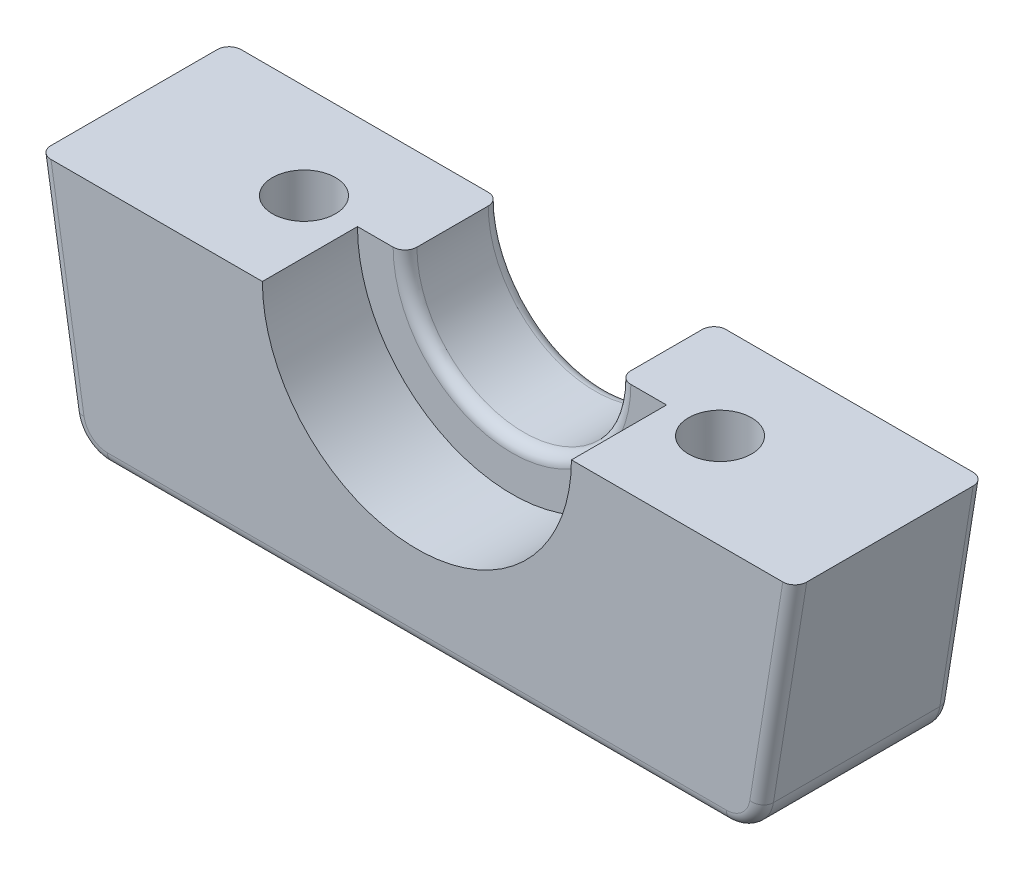
ISO-10303-21;
HEADER;
FILE_DESCRIPTION(('STEP AP214'),'2;1');
FILE_NAME('part.step','',(''),(''),'','','');
FILE_SCHEMA(('AUTOMOTIVE_DESIGN { 1 0 10303 214 1 1 1 1 }'));
ENDSEC;
DATA;
#1=APPLICATION_CONTEXT('core data for automotive mechanical design processes');
#2=APPLICATION_PROTOCOL_DEFINITION('international standard','automotive_design',2000,#1);
#3=PRODUCT_CONTEXT('',#1,'mechanical');
#4=PRODUCT('Part','Part','',(#3));
#5=PRODUCT_RELATED_PRODUCT_CATEGORY('part','',(#4));
#6=PRODUCT_DEFINITION_FORMATION('','',#4);
#7=PRODUCT_DEFINITION_CONTEXT('part definition',#1,'design');
#8=PRODUCT_DEFINITION('design','',#6,#7);
#9=PRODUCT_DEFINITION_SHAPE('','',#8);
#10=(LENGTH_UNIT() NAMED_UNIT(*) SI_UNIT(.MILLI.,.METRE.));
#11=(NAMED_UNIT(*) PLANE_ANGLE_UNIT() SI_UNIT($,.RADIAN.));
#12=(NAMED_UNIT(*) SI_UNIT($,.STERADIAN.) SOLID_ANGLE_UNIT());
#13=UNCERTAINTY_MEASURE_WITH_UNIT(LENGTH_MEASURE(1.E-05),#10,'distance_accuracy_value','');
#14=(GEOMETRIC_REPRESENTATION_CONTEXT(3) GLOBAL_UNCERTAINTY_ASSIGNED_CONTEXT((#13)) GLOBAL_UNIT_ASSIGNED_CONTEXT((#10,
#11,#12)) REPRESENTATION_CONTEXT('',''));
#15=CARTESIAN_POINT('',(0.,0.,0.));
#16=DIRECTION('',(0.,0.,1.));
#17=DIRECTION('',(1.,0.,0.));
#18=AXIS2_PLACEMENT_3D('',#15,#16,#17);
#19=CARTESIAN_POINT('',(0.,0.,8.));
#20=DIRECTION('',(0.,1.,0.));
#21=DIRECTION('',(0.,0.,1.));
#22=AXIS2_PLACEMENT_3D('',#19,#20,#21);
#23=PLANE('',#22);
#24=CARTESIAN_POINT('',(17.5,0.,0.));
#25=DIRECTION('',(0.,-1.,0.));
#26=DIRECTION('',(0.,0.,-1.));
#27=AXIS2_PLACEMENT_3D('',#24,#25,#26);
#28=CIRCLE('',#27,5.);
#29=CARTESIAN_POINT('',(17.5,0.,-5.));
#30=VERTEX_POINT('',#29);
#31=EDGE_CURVE('E382',#30,#30,#28,.T.);
#32=ORIENTED_EDGE('',*,*,#31,.F.);
#33=EDGE_LOOP('',(#32));
#34=FACE_BOUND('',#33,.T.);
#35=DIRECTION('',(0.,0.,-1.));
#36=VECTOR('',#35,1.);
#37=CARTESIAN_POINT('',(26.0322338581306,0.,8.));
#38=LINE('',#37,#36);
#39=CARTESIAN_POINT('',(26.0322338581306,0.,-7.));
#40=VERTEX_POINT('',#39);
#41=CARTESIAN_POINT('',(26.0322338581306,0.,7.));
#42=VERTEX_POINT('',#41);
#43=EDGE_CURVE('E260',#40,#42,#38,.F.);
#44=ORIENTED_EDGE('',*,*,#43,.T.);
#45=DIRECTION('',(1.,0.,0.));
#46=VECTOR('',#45,1.);
#47=CARTESIAN_POINT('',(-26.0322338581306,0.,7.));
#48=LINE('',#47,#46);
#49=CARTESIAN_POINT('',(-26.0322338581306,0.,7.));
#50=VERTEX_POINT('',#49);
#51=EDGE_CURVE('E318',#42,#50,#48,.F.);
#52=ORIENTED_EDGE('',*,*,#51,.T.);
#53=DIRECTION('',(0.,0.,-1.));
#54=VECTOR('',#53,1.);
#55=CARTESIAN_POINT('',(-26.0322338581306,0.,-8.));
#56=LINE('',#55,#54);
#57=CARTESIAN_POINT('',(-26.0322338581306,0.,-7.));
#58=VERTEX_POINT('',#57);
#59=EDGE_CURVE('E264',#50,#58,#56,.T.);
#60=ORIENTED_EDGE('',*,*,#59,.T.);
#61=DIRECTION('',(1.,0.,0.));
#62=VECTOR('',#61,1.);
#63=CARTESIAN_POINT('',(0.,0.,-7.));
#64=LINE('',#63,#62);
#65=EDGE_CURVE('E315',#58,#40,#64,.T.);
#66=ORIENTED_EDGE('',*,*,#65,.T.);
#67=EDGE_LOOP('',(#44,#52,#60,#66));
#68=FACE_BOUND('',#67,.T.);
#69=CARTESIAN_POINT('',(-17.5,0.,0.));
#70=DIRECTION('',(0.,-1.,0.));
#71=DIRECTION('',(0.,0.,-1.));
#72=AXIS2_PLACEMENT_3D('',#69,#70,#71);
#73=CIRCLE('',#72,5.);
#74=CARTESIAN_POINT('',(-17.5,0.,-5.));
#75=VERTEX_POINT('',#74);
#76=EDGE_CURVE('E442',#75,#75,#73,.T.);
#77=ORIENTED_EDGE('',*,*,#76,.F.);
#78=EDGE_LOOP('',(#77));
#79=FACE_BOUND('',#78,.T.);
#80=ADVANCED_FACE('F41',(#34,#68,#79),#23,.F.);
#81=CARTESIAN_POINT('',(31.7948717948718,20.,8.));
#82=DIRECTION('',(0.,-1.,0.));
#83=DIRECTION('',(1.,0.,0.));
#84=AXIS2_PLACEMENT_3D('',#81,#82,#83);
#85=PLANE('',#84);
#86=CARTESIAN_POINT('',(17.5,20.,0.));
#87=DIRECTION('',(0.,-1.,0.));
#88=DIRECTION('',(1.,0.,0.));
#89=AXIS2_PLACEMENT_3D('',#86,#87,#88);
#90=CIRCLE('',#89,2.65);
#91=CARTESIAN_POINT('',(20.15,20.,0.));
#92=VERTEX_POINT('',#91);
#93=EDGE_CURVE('E445',#92,#92,#90,.T.);
#94=ORIENTED_EDGE('',*,*,#93,.T.);
#95=EDGE_LOOP('',(#94));
#96=FACE_BOUND('',#95,.T.);
#97=DIRECTION('',(-1.,0.,0.));
#98=VECTOR('',#97,1.);
#99=CARTESIAN_POINT('',(31.7948717948718,20.,-8.));
#100=LINE('',#99,#98);
#101=CARTESIAN_POINT('',(30.7821121407444,20.,-8.));
#102=VERTEX_POINT('',#101);
#103=CARTESIAN_POINT('',(10.,20.,-8.));
#104=VERTEX_POINT('',#103);
#105=EDGE_CURVE('E255',#102,#104,#100,.T.);
#106=ORIENTED_EDGE('',*,*,#105,.T.);
#107=CARTESIAN_POINT('',(10.,20.,-7.00000000000001));
#108=DIRECTION('',(0.,-1.,0.));
#109=DIRECTION('',(1.,0.,0.));
#110=AXIS2_PLACEMENT_3D('',#107,#108,#109);
#111=CIRCLE('',#110,1.);
#112=CARTESIAN_POINT('',(9.00000000000001,20.,-7.00000000000001));
#113=VERTEX_POINT('',#112);
#114=EDGE_CURVE('E360',#104,#113,#111,.F.);
#115=ORIENTED_EDGE('',*,*,#114,.T.);
#116=DIRECTION('',(0.,0.,-1.));
#117=VECTOR('',#116,1.);
#118=CARTESIAN_POINT('',(9.00000000000001,20.,95.6925416989547));
#119=LINE('',#118,#117);
#120=CARTESIAN_POINT('',(9.00000000000001,20.,-1.));
#121=VERTEX_POINT('',#120);
#122=EDGE_CURVE('E242',#121,#113,#119,.T.);
#123=ORIENTED_EDGE('',*,*,#122,.F.);
#124=CARTESIAN_POINT('',(10.,20.,-1.));
#125=DIRECTION('',(0.,-1.,0.));
#126=DIRECTION('',(1.,0.,0.));
#127=AXIS2_PLACEMENT_3D('',#124,#125,#126);
#128=CIRCLE('',#127,1.);
#129=CARTESIAN_POINT('',(10.,20.,0.));
#130=VERTEX_POINT('',#129);
#131=EDGE_CURVE('E232',#121,#130,#128,.F.);
#132=ORIENTED_EDGE('',*,*,#131,.T.);
#133=DIRECTION('',(-1.,0.,0.));
#134=VECTOR('',#133,1.);
#135=CARTESIAN_POINT('',(-13.,20.,0.));
#136=LINE('',#135,#134);
#137=CARTESIAN_POINT('',(13.,20.,0.));
#138=VERTEX_POINT('',#137);
#139=EDGE_CURVE('E218',#138,#130,#136,.T.);
#140=ORIENTED_EDGE('',*,*,#139,.F.);
#141=DIRECTION('',(0.,0.,1.));
#142=VECTOR('',#141,1.);
#143=CARTESIAN_POINT('',(13.,20.,0.));
#144=LINE('',#143,#142);
#145=CARTESIAN_POINT('',(13.,20.,8.));
#146=VERTEX_POINT('',#145);
#147=EDGE_CURVE('E208',#138,#146,#144,.T.);
#148=ORIENTED_EDGE('',*,*,#147,.T.);
#149=DIRECTION('',(-1.,0.,0.));
#150=VECTOR('',#149,1.);
#151=CARTESIAN_POINT('',(31.7948717948718,20.,8.));
#152=LINE('',#151,#150);
#153=CARTESIAN_POINT('',(30.7821121407444,20.,8.));
#154=VERTEX_POINT('',#153);
#155=EDGE_CURVE('E250',#154,#146,#152,.T.);
#156=ORIENTED_EDGE('',*,*,#155,.F.);
#157=CARTESIAN_POINT('',(30.7821121407444,20.,7.));
#158=DIRECTION('',(0.,-1.,0.));
#159=DIRECTION('',(-1.,0.,0.));
#160=AXIS2_PLACEMENT_3D('',#157,#158,#159);
#161=ELLIPSE('',#160,1.01275965412741,1.);
#162=CARTESIAN_POINT('',(31.7948717948718,20.,7.));
#163=VERTEX_POINT('',#162);
#164=EDGE_CURVE('E72',#154,#163,#161,.F.);
#165=ORIENTED_EDGE('',*,*,#164,.T.);
#166=DIRECTION('',(0.,0.,-1.));
#167=VECTOR('',#166,1.);
#168=CARTESIAN_POINT('',(31.7948717948718,20.,8.));
#169=LINE('',#168,#167);
#170=CARTESIAN_POINT('',(31.7948717948718,20.,-7.));
#171=VERTEX_POINT('',#170);
#172=EDGE_CURVE('E253',#163,#171,#169,.T.);
#173=ORIENTED_EDGE('',*,*,#172,.T.);
#174=CARTESIAN_POINT('',(30.7821121407444,20.,-7.));
#175=DIRECTION('',(0.,-1.,0.));
#176=DIRECTION('',(1.,0.,0.));
#177=AXIS2_PLACEMENT_3D('',#174,#175,#176);
#178=ELLIPSE('',#177,1.01275965412741,1.);
#179=EDGE_CURVE('E353',#171,#102,#178,.F.);
#180=ORIENTED_EDGE('',*,*,#179,.T.);
#181=EDGE_LOOP('',(#106,#115,#123,#132,#140,#148,#156,#165,#173,#180));
#182=FACE_BOUND('',#181,.T.);
#183=ADVANCED_FACE('F229',(#96,#182),#85,.F.);
#184=CARTESIAN_POINT('',(28.5897435897436,0.,8.));
#185=DIRECTION('',(-0.987401103435145,0.158237356319734,0.));
#186=DIRECTION('',(-0.158237356319734,-0.987401103435145,0.));
#187=AXIS2_PLACEMENT_3D('',#184,#185,#186);
#188=PLANE('',#187);
#189=ORIENTED_EDGE('',*,*,#172,.F.);
#190=DIRECTION('',(0.158237356319734,0.987401103435145,0.));
#191=VECTOR('',#190,1.);
#192=CARTESIAN_POINT('',(28.994437168436,2.5252879310408,7.));
#193=LINE('',#192,#191);
#194=CARTESIAN_POINT('',(28.994437168436,2.5252879310408,7.));
#195=VERTEX_POINT('',#194);
#196=EDGE_CURVE('E51',#163,#195,#193,.F.);
#197=ORIENTED_EDGE('',*,*,#196,.T.);
#198=DIRECTION('',(0.,0.,-1.));
#199=VECTOR('',#198,1.);
#200=CARTESIAN_POINT('',(28.994437168436,2.5252879310408,8.));
#201=LINE('',#200,#199);
#202=CARTESIAN_POINT('',(28.994437168436,2.5252879310408,-7.));
#203=VERTEX_POINT('',#202);
#204=EDGE_CURVE('E272',#195,#203,#201,.T.);
#205=ORIENTED_EDGE('',*,*,#204,.T.);
#206=DIRECTION('',(0.158237356319734,0.987401103435145,0.));
#207=VECTOR('',#206,1.);
#208=CARTESIAN_POINT('',(28.5897435897436,0.,-7.));
#209=LINE('',#208,#207);
#210=EDGE_CURVE('E62',#203,#171,#209,.T.);
#211=ORIENTED_EDGE('',*,*,#210,.T.);
#212=EDGE_LOOP('',(#189,#197,#205,#211));
#213=FACE_BOUND('',#212,.T.);
#214=ADVANCED_FACE('F511',(#213),#188,.F.);
#215=CARTESIAN_POINT('',(-17.5,20.,0.));
#216=DIRECTION('',(0.,-1.,0.));
#217=DIRECTION('',(1.,0.,0.));
#218=AXIS2_PLACEMENT_3D('',#215,#216,#217);
#219=CIRCLE('',#218,2.65);
#220=CARTESIAN_POINT('',(-14.85,20.,0.));
#221=VERTEX_POINT('',#220);
#222=EDGE_CURVE('E429',#221,#221,#219,.T.);
#223=ORIENTED_EDGE('',*,*,#222,.T.);
#224=EDGE_LOOP('',(#223));
#225=FACE_BOUND('',#224,.T.);
#226=DIRECTION('',(0.,0.,-1.));
#227=VECTOR('',#226,1.);
#228=CARTESIAN_POINT('',(-31.7948717948718,20.,8.));
#229=LINE('',#228,#227);
#230=CARTESIAN_POINT('',(-31.7948717948718,20.,7.));
#231=VERTEX_POINT('',#230);
#232=CARTESIAN_POINT('',(-31.7948717948718,20.,-7.));
#233=VERTEX_POINT('',#232);
#234=EDGE_CURVE('E244',#231,#233,#229,.T.);
#235=ORIENTED_EDGE('',*,*,#234,.F.);
#236=CARTESIAN_POINT('',(-30.7821121407444,20.,7.));
#237=DIRECTION('',(0.,-1.,0.));
#238=DIRECTION('',(-1.,0.,0.));
#239=AXIS2_PLACEMENT_3D('',#236,#237,#238);
#240=ELLIPSE('',#239,1.01275965412741,1.);
#241=CARTESIAN_POINT('',(-30.7821121407444,20.,8.));
#242=VERTEX_POINT('',#241);
#243=EDGE_CURVE('E291',#231,#242,#240,.F.);
#244=ORIENTED_EDGE('',*,*,#243,.T.);
#245=CARTESIAN_POINT('',(-13.,20.,8.));
#246=VERTEX_POINT('',#245);
#247=EDGE_CURVE('E254',#246,#242,#152,.T.);
#248=ORIENTED_EDGE('',*,*,#247,.F.);
#249=DIRECTION('',(0.,0.,1.));
#250=VECTOR('',#249,1.);
#251=CARTESIAN_POINT('',(-13.,20.,0.));
#252=LINE('',#251,#250);
#253=CARTESIAN_POINT('',(-13.,20.,0.));
#254=VERTEX_POINT('',#253);
#255=EDGE_CURVE('E217',#254,#246,#252,.T.);
#256=ORIENTED_EDGE('',*,*,#255,.F.);
#257=CARTESIAN_POINT('',(-10.,20.,0.));
#258=VERTEX_POINT('',#257);
#259=EDGE_CURVE('E225',#258,#254,#136,.T.);
#260=ORIENTED_EDGE('',*,*,#259,.F.);
#261=CARTESIAN_POINT('',(-10.,20.,-1.));
#262=DIRECTION('',(0.,-1.,0.));
#263=DIRECTION('',(1.,0.,0.));
#264=AXIS2_PLACEMENT_3D('',#261,#262,#263);
#265=CIRCLE('',#264,1.);
#266=CARTESIAN_POINT('',(-9.,20.,-1.));
#267=VERTEX_POINT('',#266);
#268=EDGE_CURVE('E282',#258,#267,#265,.F.);
#269=ORIENTED_EDGE('',*,*,#268,.T.);
#270=DIRECTION('',(0.,0.,-1.));
#271=VECTOR('',#270,1.);
#272=CARTESIAN_POINT('',(-9.,20.,95.6925416989547));
#273=LINE('',#272,#271);
#274=CARTESIAN_POINT('',(-9.,20.,-7.00000000000001));
#275=VERTEX_POINT('',#274);
#276=EDGE_CURVE('E425',#267,#275,#273,.T.);
#277=ORIENTED_EDGE('',*,*,#276,.T.);
#278=CARTESIAN_POINT('',(-10.,20.,-7.00000000000001));
#279=DIRECTION('',(0.,-1.,0.));
#280=DIRECTION('',(1.,0.,0.));
#281=AXIS2_PLACEMENT_3D('',#278,#279,#280);
#282=CIRCLE('',#281,1.);
#283=CARTESIAN_POINT('',(-9.99999999999999,20.,-8.));
#284=VERTEX_POINT('',#283);
#285=EDGE_CURVE('E285',#275,#284,#282,.F.);
#286=ORIENTED_EDGE('',*,*,#285,.T.);
#287=CARTESIAN_POINT('',(-30.7821121407444,20.,-8.));
#288=VERTEX_POINT('',#287);
#289=EDGE_CURVE('E249',#284,#288,#100,.T.);
#290=ORIENTED_EDGE('',*,*,#289,.T.);
#291=CARTESIAN_POINT('',(-30.7821121407444,20.,-7.));
#292=DIRECTION('',(0.,-1.,0.));
#293=DIRECTION('',(1.,0.,0.));
#294=AXIS2_PLACEMENT_3D('',#291,#292,#293);
#295=ELLIPSE('',#294,1.01275965412741,1.);
#296=EDGE_CURVE('E288',#288,#233,#295,.F.);
#297=ORIENTED_EDGE('',*,*,#296,.T.);
#298=EDGE_LOOP('',(#235,#244,#248,#256,#260,#269,#277,#286,#290,#297));
#299=FACE_BOUND('',#298,.T.);
#300=ADVANCED_FACE('F505',(#225,#299),#85,.F.);
#301=CARTESIAN_POINT('',(0.,0.,8.));
#302=DIRECTION('',(0.,0.,1.));
#303=DIRECTION('',(1.,0.,0.));
#304=AXIS2_PLACEMENT_3D('',#301,#302,#303);
#305=PLANE('',#304);
#306=ORIENTED_EDGE('',*,*,#247,.T.);
#307=DIRECTION('',(-0.158237356319734,0.987401103435145,0.));
#308=VECTOR('',#307,1.);
#309=CARTESIAN_POINT('',(-26.8864821544472,-4.30873111449472,8.));
#310=LINE('',#309,#308);
#311=CARTESIAN_POINT('',(-28.0070360650009,2.68352528736053,8.));
#312=VERTEX_POINT('',#311);
#313=EDGE_CURVE('E306',#242,#312,#310,.F.);
#314=ORIENTED_EDGE('',*,*,#313,.T.);
#315=CARTESIAN_POINT('',(-26.0322338581306,3.,8.));
#316=DIRECTION('',(0.,0.,1.));
#317=DIRECTION('',(1.,0.,0.));
#318=AXIS2_PLACEMENT_3D('',#315,#316,#317);
#319=CIRCLE('',#318,2.);
#320=CARTESIAN_POINT('',(-26.0322338581306,1.,8.));
#321=VERTEX_POINT('',#320);
#322=EDGE_CURVE('E303',#312,#321,#319,.T.);
#323=ORIENTED_EDGE('',*,*,#322,.T.);
#324=DIRECTION('',(1.,0.,0.));
#325=VECTOR('',#324,1.);
#326=CARTESIAN_POINT('',(26.0322338581306,1.,8.));
#327=LINE('',#326,#325);
#328=CARTESIAN_POINT('',(26.0322338581306,1.,8.));
#329=VERTEX_POINT('',#328);
#330=EDGE_CURVE('E300',#321,#329,#327,.T.);
#331=ORIENTED_EDGE('',*,*,#330,.T.);
#332=CARTESIAN_POINT('',(26.0322338581306,3.,8.));
#333=DIRECTION('',(0.,0.,1.));
#334=DIRECTION('',(1.,0.,0.));
#335=AXIS2_PLACEMENT_3D('',#332,#333,#334);
#336=CIRCLE('',#335,2.);
#337=CARTESIAN_POINT('',(28.0070360650009,2.68352528736053,8.));
#338=VERTEX_POINT('',#337);
#339=EDGE_CURVE('E297',#329,#338,#336,.T.);
#340=ORIENTED_EDGE('',*,*,#339,.T.);
#341=DIRECTION('',(0.158237356319734,0.987401103435145,0.));
#342=VECTOR('',#341,1.);
#343=CARTESIAN_POINT('',(30.8074706914367,20.1582373563197,8.));
#344=LINE('',#343,#342);
#345=EDGE_CURVE('E294',#338,#154,#344,.T.);
#346=ORIENTED_EDGE('',*,*,#345,.T.);
#347=ORIENTED_EDGE('',*,*,#155,.T.);
#348=CARTESIAN_POINT('',(0.,20.,8.));
#349=DIRECTION('',(0.,0.,1.));
#350=DIRECTION('',(1.,0.,0.));
#351=AXIS2_PLACEMENT_3D('',#348,#349,#350);
#352=CIRCLE('',#351,13.);
#353=EDGE_CURVE('E214',#246,#146,#352,.T.);
#354=ORIENTED_EDGE('',*,*,#353,.F.);
#355=EDGE_LOOP('',(#306,#314,#323,#331,#340,#346,#347,#354));
#356=FACE_BOUND('',#355,.T.);
#357=ADVANCED_FACE('F502',(#356),#305,.T.);
#358=CARTESIAN_POINT('',(0.,0.,-8.));
#359=DIRECTION('',(0.,0.,1.));
#360=DIRECTION('',(1.,0.,0.));
#361=AXIS2_PLACEMENT_3D('',#358,#359,#360);
#362=PLANE('',#361);
#363=ORIENTED_EDGE('',*,*,#289,.F.);
#364=CARTESIAN_POINT('',(0.,20.,-8.));
#365=DIRECTION('',(0.,0.,1.));
#366=DIRECTION('',(1.,0.,0.));
#367=AXIS2_PLACEMENT_3D('',#364,#365,#366);
#368=CIRCLE('',#367,10.);
#369=EDGE_CURVE('E343',#284,#104,#368,.T.);
#370=ORIENTED_EDGE('',*,*,#369,.T.);
#371=ORIENTED_EDGE('',*,*,#105,.F.);
#372=DIRECTION('',(0.158237356319734,0.987401103435145,0.));
#373=VECTOR('',#372,1.);
#374=CARTESIAN_POINT('',(26.8864821544472,-4.30873111449473,-8.));
#375=LINE('',#374,#373);
#376=CARTESIAN_POINT('',(28.0070360650009,2.68352528736053,-8.));
#377=VERTEX_POINT('',#376);
#378=EDGE_CURVE('E327',#102,#377,#375,.F.);
#379=ORIENTED_EDGE('',*,*,#378,.T.);
#380=CARTESIAN_POINT('',(26.0322338581306,3.,-8.));
#381=DIRECTION('',(0.,0.,1.));
#382=DIRECTION('',(1.,0.,0.));
#383=AXIS2_PLACEMENT_3D('',#380,#381,#382);
#384=CIRCLE('',#383,2.);
#385=CARTESIAN_POINT('',(26.0322338581306,1.,-8.));
#386=VERTEX_POINT('',#385);
#387=EDGE_CURVE('E330',#377,#386,#384,.F.);
#388=ORIENTED_EDGE('',*,*,#387,.T.);
#389=DIRECTION('',(1.,0.,0.));
#390=VECTOR('',#389,1.);
#391=CARTESIAN_POINT('',(0.,1.,-8.));
#392=LINE('',#391,#390);
#393=CARTESIAN_POINT('',(-26.0322338581306,1.,-8.));
#394=VERTEX_POINT('',#393);
#395=EDGE_CURVE('E333',#386,#394,#392,.F.);
#396=ORIENTED_EDGE('',*,*,#395,.T.);
#397=CARTESIAN_POINT('',(-26.0322338581306,3.,-8.));
#398=DIRECTION('',(0.,0.,1.));
#399=DIRECTION('',(1.,0.,0.));
#400=AXIS2_PLACEMENT_3D('',#397,#398,#399);
#401=CIRCLE('',#400,2.);
#402=CARTESIAN_POINT('',(-28.0070360650009,2.68352528736053,-8.));
#403=VERTEX_POINT('',#402);
#404=EDGE_CURVE('E336',#394,#403,#401,.F.);
#405=ORIENTED_EDGE('',*,*,#404,.T.);
#406=DIRECTION('',(-0.158237356319734,0.987401103435145,0.));
#407=VECTOR('',#406,1.);
#408=CARTESIAN_POINT('',(-30.8074706914366,20.1582373563197,-8.));
#409=LINE('',#408,#407);
#410=EDGE_CURVE('E339',#403,#288,#409,.T.);
#411=ORIENTED_EDGE('',*,*,#410,.T.);
#412=EDGE_LOOP('',(#363,#370,#371,#379,#388,#396,#405,#411));
#413=FACE_BOUND('',#412,.T.);
#414=ADVANCED_FACE('F412',(#413),#362,.F.);
#415=CARTESIAN_POINT('',(-28.5897435897436,0.,8.));
#416=DIRECTION('',(-0.987401103435145,-0.158237356319734,0.));
#417=DIRECTION('',(0.158237356319734,-0.987401103435145,0.));
#418=AXIS2_PLACEMENT_3D('',#415,#416,#417);
#419=PLANE('',#418);
#420=DIRECTION('',(0.,0.,-1.));
#421=VECTOR('',#420,1.);
#422=CARTESIAN_POINT('',(-28.994437168436,2.5252879310408,8.));
#423=LINE('',#422,#421);
#424=CARTESIAN_POINT('',(-28.994437168436,2.5252879310408,-7.));
#425=VERTEX_POINT('',#424);
#426=CARTESIAN_POINT('',(-28.994437168436,2.5252879310408,7.));
#427=VERTEX_POINT('',#426);
#428=EDGE_CURVE('E268',#425,#427,#423,.F.);
#429=ORIENTED_EDGE('',*,*,#428,.T.);
#430=DIRECTION('',(-0.158237356319734,0.987401103435145,0.));
#431=VECTOR('',#430,1.);
#432=CARTESIAN_POINT('',(-28.5897435897436,0.,7.));
#433=LINE('',#432,#431);
#434=EDGE_CURVE('E278',#427,#231,#433,.T.);
#435=ORIENTED_EDGE('',*,*,#434,.T.);
#436=ORIENTED_EDGE('',*,*,#234,.T.);
#437=DIRECTION('',(-0.158237356319734,0.987401103435145,0.));
#438=VECTOR('',#437,1.);
#439=CARTESIAN_POINT('',(-28.994437168436,2.5252879310408,-7.));
#440=LINE('',#439,#438);
#441=EDGE_CURVE('E275',#233,#425,#440,.F.);
#442=ORIENTED_EDGE('',*,*,#441,.T.);
#443=EDGE_LOOP('',(#429,#435,#436,#442));
#444=FACE_BOUND('',#443,.T.);
#445=ADVANCED_FACE('F498',(#444),#419,.T.);
#446=CARTESIAN_POINT('',(0.,20.,0.));
#447=DIRECTION('',(0.,0.,1.));
#448=DIRECTION('',(1.,0.,0.));
#449=AXIS2_PLACEMENT_3D('',#446,#447,#448);
#450=CYLINDRICAL_SURFACE('',#449,13.);
#451=ORIENTED_EDGE('',*,*,#353,.T.);
#452=ORIENTED_EDGE('',*,*,#147,.F.);
#453=CARTESIAN_POINT('',(0.,20.,0.));
#454=DIRECTION('',(0.,0.,1.));
#455=DIRECTION('',(1.,0.,0.));
#456=AXIS2_PLACEMENT_3D('',#453,#454,#455);
#457=CIRCLE('',#456,13.);
#458=EDGE_CURVE('E211',#254,#138,#457,.T.);
#459=ORIENTED_EDGE('',*,*,#458,.F.);
#460=ORIENTED_EDGE('',*,*,#255,.T.);
#461=EDGE_LOOP('',(#451,#452,#459,#460));
#462=FACE_BOUND('',#461,.T.);
#463=ADVANCED_FACE('F210',(#462),#450,.F.);
#464=CARTESIAN_POINT('',(0.,20.,0.));
#465=DIRECTION('',(0.,0.,1.));
#466=DIRECTION('',(1.,0.,0.));
#467=AXIS2_PLACEMENT_3D('',#464,#465,#466);
#468=PLANE('',#467);
#469=ORIENTED_EDGE('',*,*,#139,.T.);
#470=CARTESIAN_POINT('',(0.,20.,0.));
#471=DIRECTION('',(0.,0.,1.));
#472=DIRECTION('',(1.,0.,0.));
#473=AXIS2_PLACEMENT_3D('',#470,#471,#472);
#474=CIRCLE('',#473,10.);
#475=EDGE_CURVE('E11',#130,#258,#474,.F.);
#476=ORIENTED_EDGE('',*,*,#475,.T.);
#477=ORIENTED_EDGE('',*,*,#259,.T.);
#478=ORIENTED_EDGE('',*,*,#458,.T.);
#479=EDGE_LOOP('',(#469,#476,#477,#478));
#480=FACE_BOUND('',#479,.T.);
#481=ADVANCED_FACE('F222',(#480),#468,.T.);
#482=CARTESIAN_POINT('',(0.,20.,95.6925416989547));
#483=DIRECTION('',(0.,0.,-1.));
#484=DIRECTION('',(-1.,0.,0.));
#485=AXIS2_PLACEMENT_3D('',#482,#483,#484);
#486=CYLINDRICAL_SURFACE('',#485,9.);
#487=ORIENTED_EDGE('',*,*,#122,.T.);
#488=CARTESIAN_POINT('',(0.,20.,-7.00000000000001));
#489=DIRECTION('',(0.,0.,1.));
#490=DIRECTION('',(1.,0.,0.));
#491=AXIS2_PLACEMENT_3D('',#488,#489,#490);
#492=CIRCLE('',#491,9.);
#493=EDGE_CURVE('E349',#113,#275,#492,.F.);
#494=ORIENTED_EDGE('',*,*,#493,.T.);
#495=ORIENTED_EDGE('',*,*,#276,.F.);
#496=CARTESIAN_POINT('',(0.,20.,-1.));
#497=DIRECTION('',(0.,0.,1.));
#498=DIRECTION('',(1.,0.,0.));
#499=AXIS2_PLACEMENT_3D('',#496,#497,#498);
#500=CIRCLE('',#499,9.);
#501=EDGE_CURVE('E346',#267,#121,#500,.T.);
#502=ORIENTED_EDGE('',*,*,#501,.T.);
#503=EDGE_LOOP('',(#487,#494,#495,#502));
#504=FACE_BOUND('',#503,.T.);
#505=ADVANCED_FACE('F420',(#504),#486,.F.);
#506=CARTESIAN_POINT('',(-17.5,0.,0.));
#507=DIRECTION('',(0.,-1.,0.));
#508=DIRECTION('',(0.,0.,-1.));
#509=AXIS2_PLACEMENT_3D('',#506,#507,#508);
#510=CYLINDRICAL_SURFACE('',#509,2.65);
#511=ORIENTED_EDGE('',*,*,#222,.F.);
#512=EDGE_LOOP('',(#511));
#513=FACE_BOUND('',#512,.T.);
#514=CARTESIAN_POINT('',(-17.5,5.,0.));
#515=DIRECTION('',(0.,-1.,0.));
#516=DIRECTION('',(0.,0.,-1.));
#517=AXIS2_PLACEMENT_3D('',#514,#515,#516);
#518=CIRCLE('',#517,2.65);
#519=CARTESIAN_POINT('',(-17.5,5.,-2.65));
#520=VERTEX_POINT('',#519);
#521=EDGE_CURVE('E434',#520,#520,#518,.T.);
#522=ORIENTED_EDGE('',*,*,#521,.T.);
#523=EDGE_LOOP('',(#522));
#524=FACE_BOUND('',#523,.T.);
#525=ADVANCED_FACE('F483',(#513,#524),#510,.F.);
#526=CARTESIAN_POINT('',(-14.85,5.,0.));
#527=DIRECTION('',(0.,1.,0.));
#528=DIRECTION('',(0.,0.,1.));
#529=AXIS2_PLACEMENT_3D('',#526,#527,#528);
#530=PLANE('',#529);
#531=ORIENTED_EDGE('',*,*,#521,.F.);
#532=EDGE_LOOP('',(#531));
#533=FACE_BOUND('',#532,.T.);
#534=CARTESIAN_POINT('',(-17.5,5.,0.));
#535=DIRECTION('',(0.,-1.,0.));
#536=DIRECTION('',(0.,0.,-1.));
#537=AXIS2_PLACEMENT_3D('',#534,#535,#536);
#538=CIRCLE('',#537,5.);
#539=CARTESIAN_POINT('',(-17.5,5.,-5.));
#540=VERTEX_POINT('',#539);
#541=EDGE_CURVE('E438',#540,#540,#538,.T.);
#542=ORIENTED_EDGE('',*,*,#541,.T.);
#543=EDGE_LOOP('',(#542));
#544=FACE_BOUND('',#543,.T.);
#545=ADVANCED_FACE('F473',(#533,#544),#530,.F.);
#546=CARTESIAN_POINT('',(-17.5,0.,0.));
#547=DIRECTION('',(0.,-1.,0.));
#548=DIRECTION('',(0.,0.,-1.));
#549=AXIS2_PLACEMENT_3D('',#546,#547,#548);
#550=CYLINDRICAL_SURFACE('',#549,5.);
#551=ORIENTED_EDGE('',*,*,#541,.F.);
#552=EDGE_LOOP('',(#551));
#553=FACE_BOUND('',#552,.T.);
#554=ORIENTED_EDGE('',*,*,#76,.T.);
#555=EDGE_LOOP('',(#554));
#556=FACE_BOUND('',#555,.T.);
#557=ADVANCED_FACE('F470',(#553,#556),#550,.F.);
#558=CARTESIAN_POINT('',(17.5,0.,0.));
#559=DIRECTION('',(0.,-1.,0.));
#560=DIRECTION('',(0.,0.,-1.));
#561=AXIS2_PLACEMENT_3D('',#558,#559,#560);
#562=CYLINDRICAL_SURFACE('',#561,2.65);
#563=ORIENTED_EDGE('',*,*,#93,.F.);
#564=EDGE_LOOP('',(#563));
#565=FACE_BOUND('',#564,.T.);
#566=CARTESIAN_POINT('',(17.5,5.,0.));
#567=DIRECTION('',(0.,-1.,0.));
#568=DIRECTION('',(0.,0.,-1.));
#569=AXIS2_PLACEMENT_3D('',#566,#567,#568);
#570=CIRCLE('',#569,2.65);
#571=CARTESIAN_POINT('',(17.5,5.,-2.65));
#572=VERTEX_POINT('',#571);
#573=EDGE_CURVE('E448',#572,#572,#570,.T.);
#574=ORIENTED_EDGE('',*,*,#573,.T.);
#575=EDGE_LOOP('',(#574));
#576=FACE_BOUND('',#575,.T.);
#577=ADVANCED_FACE('F472',(#565,#576),#562,.F.);
#578=CARTESIAN_POINT('',(20.15,5.,0.));
#579=DIRECTION('',(0.,1.,0.));
#580=DIRECTION('',(0.,0.,1.));
#581=AXIS2_PLACEMENT_3D('',#578,#579,#580);
#582=PLANE('',#581);
#583=ORIENTED_EDGE('',*,*,#573,.F.);
#584=EDGE_LOOP('',(#583));
#585=FACE_BOUND('',#584,.T.);
#586=CARTESIAN_POINT('',(17.5,5.,0.));
#587=DIRECTION('',(0.,-1.,0.));
#588=DIRECTION('',(0.,0.,-1.));
#589=AXIS2_PLACEMENT_3D('',#586,#587,#588);
#590=CIRCLE('',#589,5.);
#591=CARTESIAN_POINT('',(17.5,5.,-5.));
#592=VERTEX_POINT('',#591);
#593=EDGE_CURVE('E452',#592,#592,#590,.T.);
#594=ORIENTED_EDGE('',*,*,#593,.T.);
#595=EDGE_LOOP('',(#594));
#596=FACE_BOUND('',#595,.T.);
#597=ADVANCED_FACE('F480',(#585,#596),#582,.F.);
#598=CARTESIAN_POINT('',(17.5,0.,0.));
#599=DIRECTION('',(0.,-1.,0.));
#600=DIRECTION('',(0.,0.,-1.));
#601=AXIS2_PLACEMENT_3D('',#598,#599,#600);
#602=CYLINDRICAL_SURFACE('',#601,5.);
#603=ORIENTED_EDGE('',*,*,#593,.F.);
#604=EDGE_LOOP('',(#603));
#605=FACE_BOUND('',#604,.T.);
#606=ORIENTED_EDGE('',*,*,#31,.T.);
#607=EDGE_LOOP('',(#606));
#608=FACE_BOUND('',#607,.T.);
#609=ADVANCED_FACE('F460',(#605,#608),#602,.F.);
#610=CARTESIAN_POINT('',(-26.0322338581306,3.,8.));
#611=DIRECTION('',(0.,0.,1.));
#612=DIRECTION('',(1.,0.,0.));
#613=AXIS2_PLACEMENT_3D('',#610,#611,#612);
#614=CYLINDRICAL_SURFACE('',#613,3.);
#615=ORIENTED_EDGE('',*,*,#59,.F.);
#616=CARTESIAN_POINT('',(-26.0322338581306,3.,7.));
#617=DIRECTION('',(0.,0.,1.));
#618=DIRECTION('',(1.,0.,0.));
#619=AXIS2_PLACEMENT_3D('',#616,#617,#618);
#620=CIRCLE('',#619,3.);
#621=EDGE_CURVE('E312',#50,#427,#620,.F.);
#622=ORIENTED_EDGE('',*,*,#621,.T.);
#623=ORIENTED_EDGE('',*,*,#428,.F.);
#624=CARTESIAN_POINT('',(-26.0322338581306,3.,-7.));
#625=DIRECTION('',(0.,0.,1.));
#626=DIRECTION('',(1.,0.,0.));
#627=AXIS2_PLACEMENT_3D('',#624,#625,#626);
#628=CIRCLE('',#627,3.);
#629=EDGE_CURVE('E309',#425,#58,#628,.T.);
#630=ORIENTED_EDGE('',*,*,#629,.T.);
#631=EDGE_LOOP('',(#615,#622,#623,#630));
#632=FACE_BOUND('',#631,.T.);
#633=ADVANCED_FACE('F515',(#632),#614,.T.);
#634=CARTESIAN_POINT('',(26.0322338581306,3.,8.));
#635=DIRECTION('',(0.,0.,-1.));
#636=DIRECTION('',(-1.,0.,0.));
#637=AXIS2_PLACEMENT_3D('',#634,#635,#636);
#638=CYLINDRICAL_SURFACE('',#637,3.);
#639=ORIENTED_EDGE('',*,*,#204,.F.);
#640=CARTESIAN_POINT('',(26.0322338581306,3.,7.));
#641=DIRECTION('',(0.,0.,1.));
#642=DIRECTION('',(1.,0.,0.));
#643=AXIS2_PLACEMENT_3D('',#640,#641,#642);
#644=CIRCLE('',#643,3.);
#645=EDGE_CURVE('E324',#195,#42,#644,.F.);
#646=ORIENTED_EDGE('',*,*,#645,.T.);
#647=ORIENTED_EDGE('',*,*,#43,.F.);
#648=CARTESIAN_POINT('',(26.0322338581306,3.,-7.));
#649=DIRECTION('',(0.,0.,1.));
#650=DIRECTION('',(1.,0.,0.));
#651=AXIS2_PLACEMENT_3D('',#648,#649,#650);
#652=CIRCLE('',#651,3.);
#653=EDGE_CURVE('E321',#40,#203,#652,.T.);
#654=ORIENTED_EDGE('',*,*,#653,.T.);
#655=EDGE_LOOP('',(#639,#646,#647,#654));
#656=FACE_BOUND('',#655,.T.);
#657=ADVANCED_FACE('F518',(#656),#638,.T.);
#658=CARTESIAN_POINT('',(26.8864821544472,-4.30873111449473,7.));
#659=DIRECTION('',(-0.158237356319734,-0.987401103435145,0.));
#660=DIRECTION('',(0.987401103435145,-0.158237356319734,0.));
#661=AXIS2_PLACEMENT_3D('',#658,#659,#660);
#662=CYLINDRICAL_SURFACE('',#661,1.);
#663=ORIENTED_EDGE('',*,*,#164,.F.);
#664=ORIENTED_EDGE('',*,*,#345,.F.);
#665=CARTESIAN_POINT('',(28.0070360650009,2.68352528736053,7.));
#666=DIRECTION('',(-0.158237356319734,-0.987401103435145,0.));
#667=DIRECTION('',(0.987401103435145,-0.158237356319734,0.));
#668=AXIS2_PLACEMENT_3D('',#665,#666,#667);
#669=CIRCLE('',#668,1.);
#670=EDGE_CURVE('E378',#195,#338,#669,.T.);
#671=ORIENTED_EDGE('',*,*,#670,.F.);
#672=ORIENTED_EDGE('',*,*,#196,.F.);
#673=EDGE_LOOP('',(#663,#664,#671,#672));
#674=FACE_BOUND('',#673,.T.);
#675=ADVANCED_FACE('F522',(#674),#662,.T.);
#676=CARTESIAN_POINT('',(26.0322338581306,3.,7.));
#677=DIRECTION('',(0.,0.,1.));
#678=DIRECTION('',(1.,0.,0.));
#679=AXIS2_PLACEMENT_3D('',#676,#677,#678);
#680=TOROIDAL_SURFACE('',#679,2.,1.);
#681=ORIENTED_EDGE('',*,*,#670,.T.);
#682=ORIENTED_EDGE('',*,*,#339,.F.);
#683=CARTESIAN_POINT('',(26.0322338581306,1.,7.));
#684=DIRECTION('',(-1.,0.,0.));
#685=DIRECTION('',(0.,0.,1.));
#686=AXIS2_PLACEMENT_3D('',#683,#684,#685);
#687=CIRCLE('',#686,1.);
#688=EDGE_CURVE('E374',#42,#329,#687,.T.);
#689=ORIENTED_EDGE('',*,*,#688,.F.);
#690=ORIENTED_EDGE('',*,*,#645,.F.);
#691=EDGE_LOOP('',(#681,#682,#689,#690));
#692=FACE_BOUND('',#691,.T.);
#693=ADVANCED_FACE('F535',(#692),#680,.T.);
#694=CARTESIAN_POINT('',(0.,1.,7.));
#695=DIRECTION('',(-1.,0.,0.));
#696=DIRECTION('',(0.,0.,1.));
#697=AXIS2_PLACEMENT_3D('',#694,#695,#696);
#698=CYLINDRICAL_SURFACE('',#697,1.);
#699=ORIENTED_EDGE('',*,*,#688,.T.);
#700=ORIENTED_EDGE('',*,*,#330,.F.);
#701=CARTESIAN_POINT('',(-26.0322338581306,1.,7.));
#702=DIRECTION('',(-1.,0.,0.));
#703=DIRECTION('',(0.,0.,1.));
#704=AXIS2_PLACEMENT_3D('',#701,#702,#703);
#705=CIRCLE('',#704,1.);
#706=EDGE_CURVE('E370',#50,#321,#705,.T.);
#707=ORIENTED_EDGE('',*,*,#706,.F.);
#708=ORIENTED_EDGE('',*,*,#51,.F.);
#709=EDGE_LOOP('',(#699,#700,#707,#708));
#710=FACE_BOUND('',#709,.T.);
#711=ADVANCED_FACE('F531',(#710),#698,.T.);
#712=CARTESIAN_POINT('',(-26.0322338581306,3.,7.));
#713=DIRECTION('',(0.,0.,1.));
#714=DIRECTION('',(1.,0.,0.));
#715=AXIS2_PLACEMENT_3D('',#712,#713,#714);
#716=TOROIDAL_SURFACE('',#715,2.,1.);
#717=ORIENTED_EDGE('',*,*,#706,.T.);
#718=ORIENTED_EDGE('',*,*,#322,.F.);
#719=CARTESIAN_POINT('',(-28.0070360650009,2.68352528736053,7.));
#720=DIRECTION('',(-0.158237356319734,0.987401103435145,0.));
#721=DIRECTION('',(-0.987401103435145,-0.158237356319734,0.));
#722=AXIS2_PLACEMENT_3D('',#719,#720,#721);
#723=CIRCLE('',#722,1.);
#724=EDGE_CURVE('E366',#427,#312,#723,.T.);
#725=ORIENTED_EDGE('',*,*,#724,.F.);
#726=ORIENTED_EDGE('',*,*,#621,.F.);
#727=EDGE_LOOP('',(#717,#718,#725,#726));
#728=FACE_BOUND('',#727,.T.);
#729=ADVANCED_FACE('F527',(#728),#716,.T.);
#730=CARTESIAN_POINT('',(-27.6023424863085,0.15823735631974,7.));
#731=DIRECTION('',(-0.158237356319734,0.987401103435145,0.));
#732=DIRECTION('',(-0.987401103435145,-0.158237356319734,0.));
#733=AXIS2_PLACEMENT_3D('',#730,#731,#732);
#734=CYLINDRICAL_SURFACE('',#733,1.);
#735=ORIENTED_EDGE('',*,*,#724,.T.);
#736=ORIENTED_EDGE('',*,*,#313,.F.);
#737=ORIENTED_EDGE('',*,*,#243,.F.);
#738=ORIENTED_EDGE('',*,*,#434,.F.);
#739=EDGE_LOOP('',(#735,#736,#737,#738));
#740=FACE_BOUND('',#739,.T.);
#741=ADVANCED_FACE('F524',(#740),#734,.T.);
#742=CARTESIAN_POINT('',(27.6023424863085,0.158237356319734,-7.));
#743=DIRECTION('',(0.158237356319734,0.987401103435145,0.));
#744=DIRECTION('',(-0.987401103435145,0.158237356319734,0.));
#745=AXIS2_PLACEMENT_3D('',#742,#743,#744);
#746=CYLINDRICAL_SURFACE('',#745,1.);
#747=ORIENTED_EDGE('',*,*,#179,.F.);
#748=ORIENTED_EDGE('',*,*,#210,.F.);
#749=CARTESIAN_POINT('',(28.0070360650009,2.68352528736053,-7.));
#750=DIRECTION('',(-0.158237356319734,-0.987401103435145,0.));
#751=DIRECTION('',(0.987401103435145,-0.158237356319734,0.));
#752=AXIS2_PLACEMENT_3D('',#749,#750,#751);
#753=CIRCLE('',#752,1.);
#754=EDGE_CURVE('E45',#377,#203,#753,.T.);
#755=ORIENTED_EDGE('',*,*,#754,.F.);
#756=ORIENTED_EDGE('',*,*,#378,.F.);
#757=EDGE_LOOP('',(#747,#748,#755,#756));
#758=FACE_BOUND('',#757,.T.);
#759=ADVANCED_FACE('F407',(#758),#746,.T.);
#760=CARTESIAN_POINT('',(26.0322338581306,3.,-7.));
#761=DIRECTION('',(0.,0.,1.));
#762=DIRECTION('',(1.,0.,0.));
#763=AXIS2_PLACEMENT_3D('',#760,#761,#762);
#764=TOROIDAL_SURFACE('',#763,2.,1.);
#765=ORIENTED_EDGE('',*,*,#754,.T.);
#766=ORIENTED_EDGE('',*,*,#653,.F.);
#767=CARTESIAN_POINT('',(26.0322338581306,1.,-7.));
#768=DIRECTION('',(-1.,0.,0.));
#769=DIRECTION('',(0.,0.,1.));
#770=AXIS2_PLACEMENT_3D('',#767,#768,#769);
#771=CIRCLE('',#770,1.);
#772=EDGE_CURVE('E390',#386,#40,#771,.T.);
#773=ORIENTED_EDGE('',*,*,#772,.F.);
#774=ORIENTED_EDGE('',*,*,#387,.F.);
#775=EDGE_LOOP('',(#765,#766,#773,#774));
#776=FACE_BOUND('',#775,.T.);
#777=ADVANCED_FACE('F403',(#776),#764,.T.);
#778=CARTESIAN_POINT('',(0.,1.,-7.));
#779=DIRECTION('',(1.,0.,0.));
#780=DIRECTION('',(0.,0.,-1.));
#781=AXIS2_PLACEMENT_3D('',#778,#779,#780);
#782=CYLINDRICAL_SURFACE('',#781,1.);
#783=ORIENTED_EDGE('',*,*,#772,.T.);
#784=ORIENTED_EDGE('',*,*,#65,.F.);
#785=CARTESIAN_POINT('',(-26.0322338581306,1.,-7.));
#786=DIRECTION('',(-1.,0.,0.));
#787=DIRECTION('',(0.,0.,1.));
#788=AXIS2_PLACEMENT_3D('',#785,#786,#787);
#789=CIRCLE('',#788,1.);
#790=EDGE_CURVE('E387',#394,#58,#789,.T.);
#791=ORIENTED_EDGE('',*,*,#790,.F.);
#792=ORIENTED_EDGE('',*,*,#395,.F.);
#793=EDGE_LOOP('',(#783,#784,#791,#792));
#794=FACE_BOUND('',#793,.T.);
#795=ADVANCED_FACE('F550',(#794),#782,.T.);
#796=CARTESIAN_POINT('',(-26.0322338581306,3.,-7.));
#797=DIRECTION('',(0.,0.,1.));
#798=DIRECTION('',(1.,0.,0.));
#799=AXIS2_PLACEMENT_3D('',#796,#797,#798);
#800=TOROIDAL_SURFACE('',#799,2.,1.);
#801=ORIENTED_EDGE('',*,*,#790,.T.);
#802=ORIENTED_EDGE('',*,*,#629,.F.);
#803=CARTESIAN_POINT('',(-28.0070360650009,2.68352528736053,-7.));
#804=DIRECTION('',(-0.158237356319734,0.987401103435145,0.));
#805=DIRECTION('',(-0.987401103435145,-0.158237356319734,0.));
#806=AXIS2_PLACEMENT_3D('',#803,#804,#805);
#807=CIRCLE('',#806,1.);
#808=EDGE_CURVE('E383',#403,#425,#807,.T.);
#809=ORIENTED_EDGE('',*,*,#808,.F.);
#810=ORIENTED_EDGE('',*,*,#404,.F.);
#811=EDGE_LOOP('',(#801,#802,#809,#810));
#812=FACE_BOUND('',#811,.T.);
#813=ADVANCED_FACE('F546',(#812),#800,.T.);
#814=CARTESIAN_POINT('',(-26.8864821544472,-4.30873111449472,-7.));
#815=DIRECTION('',(0.158237356319734,-0.987401103435145,0.));
#816=DIRECTION('',(0.987401103435145,0.158237356319734,0.));
#817=AXIS2_PLACEMENT_3D('',#814,#815,#816);
#818=CYLINDRICAL_SURFACE('',#817,1.);
#819=ORIENTED_EDGE('',*,*,#808,.T.);
#820=ORIENTED_EDGE('',*,*,#441,.F.);
#821=ORIENTED_EDGE('',*,*,#296,.F.);
#822=ORIENTED_EDGE('',*,*,#410,.F.);
#823=EDGE_LOOP('',(#819,#820,#821,#822));
#824=FACE_BOUND('',#823,.T.);
#825=ADVANCED_FACE('F543',(#824),#818,.T.);
#826=CARTESIAN_POINT('',(0.,20.,-7.00000000000001));
#827=DIRECTION('',(0.,0.,1.));
#828=DIRECTION('',(1.,0.,0.));
#829=AXIS2_PLACEMENT_3D('',#826,#827,#828);
#830=TOROIDAL_SURFACE('',#829,10.,1.);
#831=ORIENTED_EDGE('',*,*,#114,.F.);
#832=ORIENTED_EDGE('',*,*,#369,.F.);
#833=ORIENTED_EDGE('',*,*,#285,.F.);
#834=ORIENTED_EDGE('',*,*,#493,.F.);
#835=EDGE_LOOP('',(#831,#832,#833,#834));
#836=FACE_BOUND('',#835,.T.);
#837=ADVANCED_FACE('F416',(#836),#830,.T.);
#838=CARTESIAN_POINT('',(0.,20.,-1.));
#839=DIRECTION('',(0.,0.,1.));
#840=DIRECTION('',(1.,0.,0.));
#841=AXIS2_PLACEMENT_3D('',#838,#839,#840);
#842=TOROIDAL_SURFACE('',#841,10.,1.);
#843=ORIENTED_EDGE('',*,*,#131,.F.);
#844=ORIENTED_EDGE('',*,*,#501,.F.);
#845=ORIENTED_EDGE('',*,*,#268,.F.);
#846=ORIENTED_EDGE('',*,*,#475,.F.);
#847=EDGE_LOOP('',(#843,#844,#845,#846));
#848=FACE_BOUND('',#847,.T.);
#849=ADVANCED_FACE('F43',(#848),#842,.T.);
#850=CLOSED_SHELL('',(#80,#183,#214,#300,#357,#414,#445,#463,#481,#505,#525,#545,#557,#577,#597,
#609,#633,#657,#675,#693,#711,#729,#741,#759,#777,#795,#813,#825,#837,#849));
#851=MANIFOLD_SOLID_BREP('B2',#850);
#852=ADVANCED_BREP_SHAPE_REPRESENTATION('',(#18,#851),#14);
#853=SHAPE_DEFINITION_REPRESENTATION(#9,#852);
ENDSEC;
END-ISO-10303-21;
